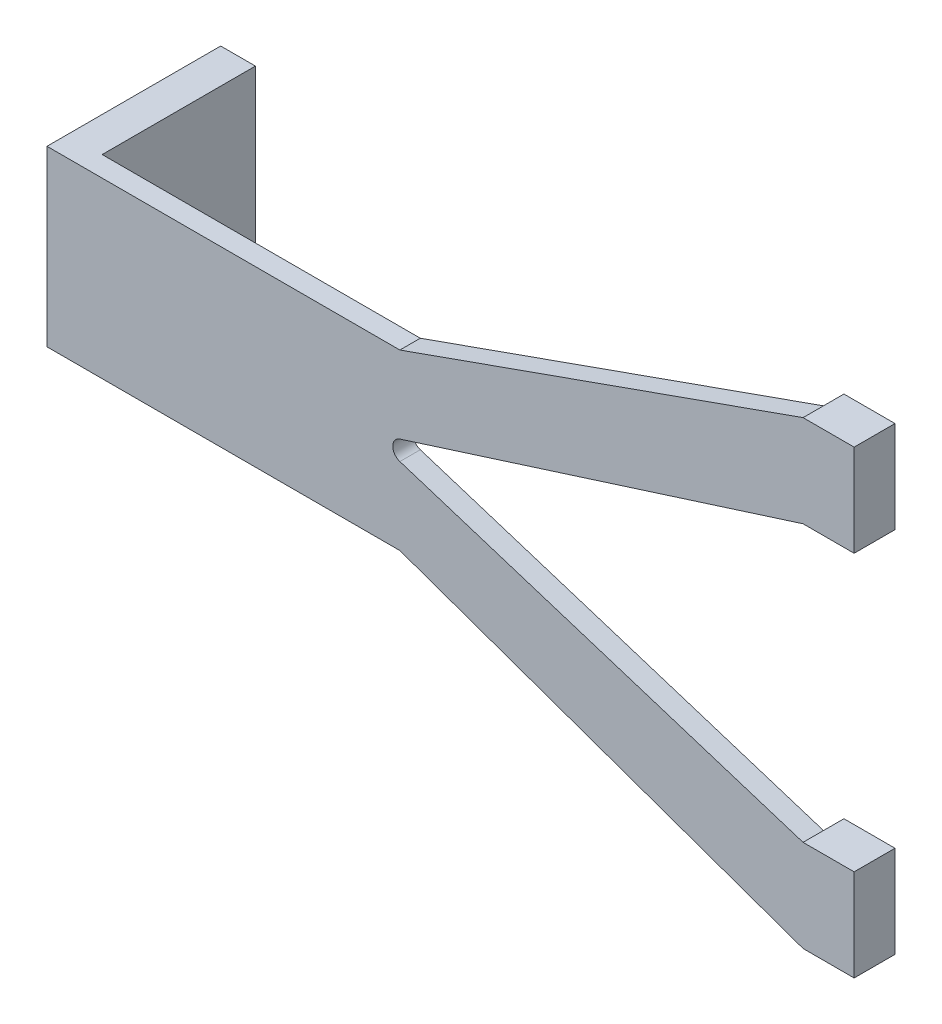
ISO-10303-21;
HEADER;
FILE_DESCRIPTION(('STEP AP214'),'2;1');
FILE_NAME('part.step','',(''),(''),'','','');
FILE_SCHEMA(('AUTOMOTIVE_DESIGN { 1 0 10303 214 1 1 1 1 }'));
ENDSEC;
DATA;
#1=APPLICATION_CONTEXT('core data for automotive mechanical design processes');
#2=APPLICATION_PROTOCOL_DEFINITION('international standard','automotive_design',2000,#1);
#3=PRODUCT_CONTEXT('',#1,'mechanical');
#4=PRODUCT('Part','Part','',(#3));
#5=PRODUCT_RELATED_PRODUCT_CATEGORY('part','',(#4));
#6=PRODUCT_DEFINITION_FORMATION('','',#4);
#7=PRODUCT_DEFINITION_CONTEXT('part definition',#1,'design');
#8=PRODUCT_DEFINITION('design','',#6,#7);
#9=PRODUCT_DEFINITION_SHAPE('','',#8);
#10=(LENGTH_UNIT() NAMED_UNIT(*) SI_UNIT(.MILLI.,.METRE.));
#11=(NAMED_UNIT(*) PLANE_ANGLE_UNIT() SI_UNIT($,.RADIAN.));
#12=(NAMED_UNIT(*) SI_UNIT($,.STERADIAN.) SOLID_ANGLE_UNIT());
#13=UNCERTAINTY_MEASURE_WITH_UNIT(LENGTH_MEASURE(1.E-05),#10,'distance_accuracy_value','');
#14=(GEOMETRIC_REPRESENTATION_CONTEXT(3) GLOBAL_UNCERTAINTY_ASSIGNED_CONTEXT((#13)) GLOBAL_UNIT_ASSIGNED_CONTEXT((#10,
#11,#12)) REPRESENTATION_CONTEXT('',''));
#15=CARTESIAN_POINT('',(0.,0.,0.));
#16=DIRECTION('',(0.,0.,1.));
#17=DIRECTION('',(1.,0.,0.));
#18=AXIS2_PLACEMENT_3D('',#15,#16,#17);
#19=CARTESIAN_POINT('',(30.9634263042626,0.,0.));
#20=DIRECTION('',(0.,0.,1.));
#21=DIRECTION('',(1.,0.,0.));
#22=AXIS2_PLACEMENT_3D('',#19,#20,#21);
#23=PLANE('',#22);
#24=DIRECTION('',(0.,1.,0.));
#25=VECTOR('',#24,1.);
#26=CARTESIAN_POINT('',(70.1215244929439,0.,0.));
#27=LINE('',#26,#25);
#28=CARTESIAN_POINT('',(70.1215244929439,-22.5,0.));
#29=VERTEX_POINT('',#28);
#30=CARTESIAN_POINT('',(70.1215244929439,-13.5,0.));
#31=VERTEX_POINT('',#30);
#32=EDGE_CURVE('E238',#29,#31,#27,.T.);
#33=ORIENTED_EDGE('',*,*,#32,.F.);
#34=DIRECTION('',(0.94244527418726,-0.334360441981553,0.));
#35=VECTOR('',#34,1.);
#36=CARTESIAN_POINT('',(30.6604155159748,-8.5,0.));
#37=LINE('',#36,#35);
#38=CARTESIAN_POINT('',(30.6604155159748,-8.5,0.));
#39=VERTEX_POINT('',#38);
#40=EDGE_CURVE('E180',#39,#29,#37,.T.);
#41=ORIENTED_EDGE('',*,*,#40,.F.);
#42=DIRECTION('',(1.,0.,0.));
#43=VECTOR('',#42,1.);
#44=CARTESIAN_POINT('',(-3.87847550705608,-8.5,0.));
#45=LINE('',#44,#43);
#46=CARTESIAN_POINT('',(-0.478475507056084,-8.5,0.));
#47=VERTEX_POINT('',#46);
#48=EDGE_CURVE('E90',#47,#39,#45,.T.);
#49=ORIENTED_EDGE('',*,*,#48,.F.);
#50=DIRECTION('',(0.,-1.,0.));
#51=VECTOR('',#50,1.);
#52=CARTESIAN_POINT('',(-0.478475507056084,-8.5,0.));
#53=LINE('',#52,#51);
#54=CARTESIAN_POINT('',(-0.478475507056084,8.5,0.));
#55=VERTEX_POINT('',#54);
#56=EDGE_CURVE('E57',#55,#47,#53,.T.);
#57=ORIENTED_EDGE('',*,*,#56,.F.);
#58=DIRECTION('',(-1.,0.,0.));
#59=VECTOR('',#58,1.);
#60=CARTESIAN_POINT('',(-3.87847550705608,8.5,0.));
#61=LINE('',#60,#59);
#62=CARTESIAN_POINT('',(30.6604155159748,8.5,0.));
#63=VERTEX_POINT('',#62);
#64=EDGE_CURVE('E175',#63,#55,#61,.T.);
#65=ORIENTED_EDGE('',*,*,#64,.F.);
#66=DIRECTION('',(-0.94244527418726,-0.334360441981553,0.));
#67=VECTOR('',#66,1.);
#68=CARTESIAN_POINT('',(30.6604155159748,8.5,0.));
#69=LINE('',#68,#67);
#70=CARTESIAN_POINT('',(70.1215244929439,22.5,0.));
#71=VERTEX_POINT('',#70);
#72=EDGE_CURVE('E172',#71,#63,#69,.T.);
#73=ORIENTED_EDGE('',*,*,#72,.F.);
#74=DIRECTION('',(0.,-1.,0.));
#75=VECTOR('',#74,1.);
#76=CARTESIAN_POINT('',(70.1215244929439,0.,0.));
#77=LINE('',#76,#75);
#78=CARTESIAN_POINT('',(70.1215244929439,13.5,0.));
#79=VERTEX_POINT('',#78);
#80=EDGE_CURVE('E359',#71,#79,#77,.T.);
#81=ORIENTED_EDGE('',*,*,#80,.T.);
#82=DIRECTION('',(0.952987125926258,0.303010788287828,0.));
#83=VECTOR('',#82,1.);
#84=CARTESIAN_POINT('',(70.1215244929439,13.5,0.));
#85=LINE('',#84,#83);
#86=CARTESIAN_POINT('',(30.6604155159748,0.95298712592625,0.));
#87=VERTEX_POINT('',#86);
#88=EDGE_CURVE('E168',#87,#79,#85,.T.);
#89=ORIENTED_EDGE('',*,*,#88,.F.);
#90=CARTESIAN_POINT('',(30.9634263042626,0.,0.));
#91=DIRECTION('',(0.,0.,-1.));
#92=DIRECTION('',(1.,0.,0.));
#93=AXIS2_PLACEMENT_3D('',#90,#91,#92);
#94=CIRCLE('',#93,0.999999999999993);
#95=CARTESIAN_POINT('',(30.6604155159748,-0.952987125926251,0.));
#96=VERTEX_POINT('',#95);
#97=EDGE_CURVE('E164',#96,#87,#94,.T.);
#98=ORIENTED_EDGE('',*,*,#97,.F.);
#99=DIRECTION('',(-0.952987125926258,0.303010788287828,0.));
#100=VECTOR('',#99,1.);
#101=CARTESIAN_POINT('',(70.1215244929439,-13.5,0.));
#102=LINE('',#101,#100);
#103=EDGE_CURVE('E161',#31,#96,#102,.T.);
#104=ORIENTED_EDGE('',*,*,#103,.F.);
#105=EDGE_LOOP('',(#33,#41,#49,#57,#65,#73,#81,#89,#98,#104));
#106=FACE_BOUND('',#105,.T.);
#107=ADVANCED_FACE('F41',(#106),#23,.F.);
#108=CARTESIAN_POINT('',(75.1215244929439,-22.5,2.));
#109=DIRECTION('',(-1.,0.,0.));
#110=DIRECTION('',(0.,0.,1.));
#111=AXIS2_PLACEMENT_3D('',#108,#109,#110);
#112=PLANE('',#111);
#113=DIRECTION('',(0.,0.,-1.));
#114=VECTOR('',#113,1.);
#115=CARTESIAN_POINT('',(75.1215244929439,-22.5,2.));
#116=LINE('',#115,#114);
#117=CARTESIAN_POINT('',(75.1215244929439,-22.5,2.));
#118=VERTEX_POINT('',#117);
#119=CARTESIAN_POINT('',(75.1215244929439,-22.5,-2.));
#120=VERTEX_POINT('',#119);
#121=EDGE_CURVE('E157',#118,#120,#116,.T.);
#122=ORIENTED_EDGE('',*,*,#121,.T.);
#123=DIRECTION('',(0.,-1.,0.));
#124=VECTOR('',#123,1.);
#125=CARTESIAN_POINT('',(75.1215244929439,0.,-2.));
#126=LINE('',#125,#124);
#127=CARTESIAN_POINT('',(75.1215244929439,-13.5,-2.));
#128=VERTEX_POINT('',#127);
#129=EDGE_CURVE('E325',#128,#120,#126,.T.);
#130=ORIENTED_EDGE('',*,*,#129,.F.);
#131=DIRECTION('',(0.,0.,-1.));
#132=VECTOR('',#131,1.);
#133=CARTESIAN_POINT('',(75.1215244929439,-13.5,2.));
#134=LINE('',#133,#132);
#135=CARTESIAN_POINT('',(75.1215244929439,-13.5,2.));
#136=VERTEX_POINT('',#135);
#137=EDGE_CURVE('E11',#136,#128,#134,.T.);
#138=ORIENTED_EDGE('',*,*,#137,.F.);
#139=DIRECTION('',(0.,1.,0.));
#140=VECTOR('',#139,1.);
#141=CARTESIAN_POINT('',(75.1215244929439,-22.5,2.));
#142=LINE('',#141,#140);
#143=EDGE_CURVE('E183',#118,#136,#142,.T.);
#144=ORIENTED_EDGE('',*,*,#143,.F.);
#145=EDGE_LOOP('',(#122,#130,#138,#144));
#146=FACE_BOUND('',#145,.T.);
#147=ADVANCED_FACE('F43',(#146),#112,.F.);
#148=CARTESIAN_POINT('',(70.1215244929439,-13.5,2.));
#149=DIRECTION('',(0.,-1.,0.));
#150=DIRECTION('',(1.,0.,0.));
#151=AXIS2_PLACEMENT_3D('',#148,#149,#150);
#152=PLANE('',#151);
#153=ORIENTED_EDGE('',*,*,#137,.T.);
#154=DIRECTION('',(1.,0.,0.));
#155=VECTOR('',#154,1.);
#156=CARTESIAN_POINT('',(0.,-13.5,-2.));
#157=LINE('',#156,#155);
#158=CARTESIAN_POINT('',(70.1215244929439,-13.5,-2.));
#159=VERTEX_POINT('',#158);
#160=EDGE_CURVE('E330',#159,#128,#157,.T.);
#161=ORIENTED_EDGE('',*,*,#160,.F.);
#162=DIRECTION('',(0.,0.,1.));
#163=VECTOR('',#162,1.);
#164=CARTESIAN_POINT('',(70.1215244929439,-13.5,-2.));
#165=LINE('',#164,#163);
#166=EDGE_CURVE('E345',#159,#31,#165,.T.);
#167=ORIENTED_EDGE('',*,*,#166,.T.);
#168=DIRECTION('',(0.,0.,-1.));
#169=VECTOR('',#168,1.);
#170=CARTESIAN_POINT('',(70.1215244929439,-13.5,2.));
#171=LINE('',#170,#169);
#172=CARTESIAN_POINT('',(70.1215244929439,-13.5,2.));
#173=VERTEX_POINT('',#172);
#174=EDGE_CURVE('E50',#173,#31,#171,.T.);
#175=ORIENTED_EDGE('',*,*,#174,.F.);
#176=DIRECTION('',(-1.,0.,0.));
#177=VECTOR('',#176,1.);
#178=CARTESIAN_POINT('',(70.1215244929439,-13.5,2.));
#179=LINE('',#178,#177);
#180=EDGE_CURVE('E98',#136,#173,#179,.T.);
#181=ORIENTED_EDGE('',*,*,#180,.F.);
#182=EDGE_LOOP('',(#153,#161,#167,#175,#181));
#183=FACE_BOUND('',#182,.T.);
#184=ADVANCED_FACE('F328',(#183),#152,.F.);
#185=CARTESIAN_POINT('',(70.1215244929439,-13.5,2.));
#186=DIRECTION('',(-0.303010788287828,-0.952987125926258,0.));
#187=DIRECTION('',(0.952987125926258,-0.303010788287828,0.));
#188=AXIS2_PLACEMENT_3D('',#185,#186,#187);
#189=PLANE('',#188);
#190=ORIENTED_EDGE('',*,*,#103,.T.);
#191=DIRECTION('',(0.,0.,-1.));
#192=VECTOR('',#191,1.);
#193=CARTESIAN_POINT('',(30.6604155159748,-0.952987125926251,2.));
#194=LINE('',#193,#192);
#195=CARTESIAN_POINT('',(30.6604155159748,-0.952987125926251,2.));
#196=VERTEX_POINT('',#195);
#197=EDGE_CURVE('E219',#196,#96,#194,.T.);
#198=ORIENTED_EDGE('',*,*,#197,.F.);
#199=DIRECTION('',(-0.952987125926258,0.303010788287828,0.));
#200=VECTOR('',#199,1.);
#201=CARTESIAN_POINT('',(70.1215244929439,-13.5,2.));
#202=LINE('',#201,#200);
#203=EDGE_CURVE('E230',#173,#196,#202,.T.);
#204=ORIENTED_EDGE('',*,*,#203,.F.);
#205=ORIENTED_EDGE('',*,*,#174,.T.);
#206=EDGE_LOOP('',(#190,#198,#204,#205));
#207=FACE_BOUND('',#206,.T.);
#208=ADVANCED_FACE('F228',(#207),#189,.F.);
#209=CARTESIAN_POINT('',(30.9634263042626,0.,2.));
#210=DIRECTION('',(0.,0.,-1.));
#211=DIRECTION('',(-1.,0.,0.));
#212=AXIS2_PLACEMENT_3D('',#209,#210,#211);
#213=CYLINDRICAL_SURFACE('',#212,0.999999999999993);
#214=ORIENTED_EDGE('',*,*,#97,.T.);
#215=DIRECTION('',(0.,0.,-1.));
#216=VECTOR('',#215,1.);
#217=CARTESIAN_POINT('',(30.6604155159748,0.95298712592625,2.));
#218=LINE('',#217,#216);
#219=CARTESIAN_POINT('',(30.6604155159748,0.95298712592625,2.));
#220=VERTEX_POINT('',#219);
#221=EDGE_CURVE('E215',#220,#87,#218,.T.);
#222=ORIENTED_EDGE('',*,*,#221,.F.);
#223=CARTESIAN_POINT('',(30.9634263042626,0.,2.));
#224=DIRECTION('',(0.,0.,-1.));
#225=DIRECTION('',(1.,0.,0.));
#226=AXIS2_PLACEMENT_3D('',#223,#224,#225);
#227=CIRCLE('',#226,0.999999999999993);
#228=EDGE_CURVE('E254',#196,#220,#227,.T.);
#229=ORIENTED_EDGE('',*,*,#228,.F.);
#230=ORIENTED_EDGE('',*,*,#197,.T.);
#231=EDGE_LOOP('',(#214,#222,#229,#230));
#232=FACE_BOUND('',#231,.T.);
#233=ADVANCED_FACE('F243',(#232),#213,.F.);
#234=CARTESIAN_POINT('',(70.1215244929439,13.5,2.));
#235=DIRECTION('',(-0.303010788287828,0.952987125926258,0.));
#236=DIRECTION('',(-0.952987125926258,-0.303010788287828,0.));
#237=AXIS2_PLACEMENT_3D('',#234,#235,#236);
#238=PLANE('',#237);
#239=ORIENTED_EDGE('',*,*,#88,.T.);
#240=DIRECTION('',(0.,0.,-1.));
#241=VECTOR('',#240,1.);
#242=CARTESIAN_POINT('',(70.1215244929439,13.5,2.));
#243=LINE('',#242,#241);
#244=CARTESIAN_POINT('',(70.1215244929439,13.5,2.));
#245=VERTEX_POINT('',#244);
#246=EDGE_CURVE('E211',#245,#79,#243,.T.);
#247=ORIENTED_EDGE('',*,*,#246,.F.);
#248=DIRECTION('',(0.952987125926258,0.303010788287828,0.));
#249=VECTOR('',#248,1.);
#250=CARTESIAN_POINT('',(70.1215244929439,13.5,2.));
#251=LINE('',#250,#249);
#252=EDGE_CURVE('E250',#220,#245,#251,.T.);
#253=ORIENTED_EDGE('',*,*,#252,.F.);
#254=ORIENTED_EDGE('',*,*,#221,.T.);
#255=EDGE_LOOP('',(#239,#247,#253,#254));
#256=FACE_BOUND('',#255,.T.);
#257=ADVANCED_FACE('F247',(#256),#238,.F.);
#258=CARTESIAN_POINT('',(70.1215244929439,13.5,2.));
#259=DIRECTION('',(0.,1.,0.));
#260=DIRECTION('',(-1.,0.,0.));
#261=AXIS2_PLACEMENT_3D('',#258,#259,#260);
#262=PLANE('',#261);
#263=ORIENTED_EDGE('',*,*,#246,.T.);
#264=DIRECTION('',(0.,0.,1.));
#265=VECTOR('',#264,1.);
#266=CARTESIAN_POINT('',(70.1215244929439,13.5,-2.));
#267=LINE('',#266,#265);
#268=CARTESIAN_POINT('',(70.1215244929439,13.5,-2.));
#269=VERTEX_POINT('',#268);
#270=EDGE_CURVE('E376',#269,#79,#267,.T.);
#271=ORIENTED_EDGE('',*,*,#270,.F.);
#272=DIRECTION('',(-1.,0.,0.));
#273=VECTOR('',#272,1.);
#274=CARTESIAN_POINT('',(0.,13.5,-2.));
#275=LINE('',#274,#273);
#276=CARTESIAN_POINT('',(75.1215244929439,13.5,-2.));
#277=VERTEX_POINT('',#276);
#278=EDGE_CURVE('E372',#277,#269,#275,.T.);
#279=ORIENTED_EDGE('',*,*,#278,.F.);
#280=DIRECTION('',(0.,0.,-1.));
#281=VECTOR('',#280,1.);
#282=CARTESIAN_POINT('',(75.1215244929439,13.5,2.));
#283=LINE('',#282,#281);
#284=CARTESIAN_POINT('',(75.1215244929439,13.5,2.));
#285=VERTEX_POINT('',#284);
#286=EDGE_CURVE('E207',#285,#277,#283,.T.);
#287=ORIENTED_EDGE('',*,*,#286,.F.);
#288=DIRECTION('',(1.,0.,0.));
#289=VECTOR('',#288,1.);
#290=CARTESIAN_POINT('',(70.1215244929439,13.5,2.));
#291=LINE('',#290,#289);
#292=EDGE_CURVE('E253',#245,#285,#291,.T.);
#293=ORIENTED_EDGE('',*,*,#292,.F.);
#294=EDGE_LOOP('',(#263,#271,#279,#287,#293));
#295=FACE_BOUND('',#294,.T.);
#296=ADVANCED_FACE('F424',(#295),#262,.F.);
#297=CARTESIAN_POINT('',(75.1215244929439,22.5,2.));
#298=DIRECTION('',(-1.,0.,0.));
#299=DIRECTION('',(0.,0.,1.));
#300=AXIS2_PLACEMENT_3D('',#297,#298,#299);
#301=PLANE('',#300);
#302=ORIENTED_EDGE('',*,*,#286,.T.);
#303=DIRECTION('',(0.,-1.,0.));
#304=VECTOR('',#303,1.);
#305=CARTESIAN_POINT('',(75.1215244929439,0.,-2.));
#306=LINE('',#305,#304);
#307=CARTESIAN_POINT('',(75.1215244929439,22.5,-2.));
#308=VERTEX_POINT('',#307);
#309=EDGE_CURVE('E368',#308,#277,#306,.T.);
#310=ORIENTED_EDGE('',*,*,#309,.F.);
#311=DIRECTION('',(0.,0.,-1.));
#312=VECTOR('',#311,1.);
#313=CARTESIAN_POINT('',(75.1215244929439,22.5,2.));
#314=LINE('',#313,#312);
#315=CARTESIAN_POINT('',(75.1215244929439,22.5,2.));
#316=VERTEX_POINT('',#315);
#317=EDGE_CURVE('E203',#316,#308,#314,.T.);
#318=ORIENTED_EDGE('',*,*,#317,.F.);
#319=DIRECTION('',(0.,1.,0.));
#320=VECTOR('',#319,1.);
#321=CARTESIAN_POINT('',(75.1215244929439,22.5,2.));
#322=LINE('',#321,#320);
#323=EDGE_CURVE('E258',#285,#316,#322,.T.);
#324=ORIENTED_EDGE('',*,*,#323,.F.);
#325=EDGE_LOOP('',(#302,#310,#318,#324));
#326=FACE_BOUND('',#325,.T.);
#327=ADVANCED_FACE('F421',(#326),#301,.F.);
#328=CARTESIAN_POINT('',(70.1215244929439,22.5,2.));
#329=DIRECTION('',(0.,-1.,0.));
#330=DIRECTION('',(0.,0.,-1.));
#331=AXIS2_PLACEMENT_3D('',#328,#329,#330);
#332=PLANE('',#331);
#333=ORIENTED_EDGE('',*,*,#317,.T.);
#334=DIRECTION('',(1.,0.,0.));
#335=VECTOR('',#334,1.);
#336=CARTESIAN_POINT('',(0.,22.5,-2.));
#337=LINE('',#336,#335);
#338=CARTESIAN_POINT('',(70.1215244929439,22.5,-2.));
#339=VERTEX_POINT('',#338);
#340=EDGE_CURVE('E364',#339,#308,#337,.T.);
#341=ORIENTED_EDGE('',*,*,#340,.F.);
#342=DIRECTION('',(0.,0.,1.));
#343=VECTOR('',#342,1.);
#344=CARTESIAN_POINT('',(70.1215244929439,22.5,-2.));
#345=LINE('',#344,#343);
#346=EDGE_CURVE('E310',#339,#71,#345,.T.);
#347=ORIENTED_EDGE('',*,*,#346,.T.);
#348=DIRECTION('',(0.,0.,-1.));
#349=VECTOR('',#348,1.);
#350=CARTESIAN_POINT('',(70.1215244929439,22.5,2.));
#351=LINE('',#350,#349);
#352=CARTESIAN_POINT('',(70.1215244929439,22.5,2.));
#353=VERTEX_POINT('',#352);
#354=EDGE_CURVE('E199',#353,#71,#351,.T.);
#355=ORIENTED_EDGE('',*,*,#354,.F.);
#356=DIRECTION('',(-1.,0.,0.));
#357=VECTOR('',#356,1.);
#358=CARTESIAN_POINT('',(70.1215244929439,22.5,2.));
#359=LINE('',#358,#357);
#360=EDGE_CURVE('E265',#316,#353,#359,.T.);
#361=ORIENTED_EDGE('',*,*,#360,.F.);
#362=EDGE_LOOP('',(#333,#341,#347,#355,#361));
#363=FACE_BOUND('',#362,.T.);
#364=ADVANCED_FACE('F415',(#363),#332,.F.);
#365=CARTESIAN_POINT('',(30.6604155159748,8.5,2.));
#366=DIRECTION('',(0.334360441981553,-0.94244527418726,0.));
#367=DIRECTION('',(0.94244527418726,0.334360441981553,0.));
#368=AXIS2_PLACEMENT_3D('',#365,#366,#367);
#369=PLANE('',#368);
#370=ORIENTED_EDGE('',*,*,#72,.T.);
#371=DIRECTION('',(0.,0.,-1.));
#372=VECTOR('',#371,1.);
#373=CARTESIAN_POINT('',(30.6604155159748,8.5,2.));
#374=LINE('',#373,#372);
#375=CARTESIAN_POINT('',(30.6604155159748,8.5,2.));
#376=VERTEX_POINT('',#375);
#377=EDGE_CURVE('E195',#376,#63,#374,.T.);
#378=ORIENTED_EDGE('',*,*,#377,.F.);
#379=DIRECTION('',(-0.94244527418726,-0.334360441981553,0.));
#380=VECTOR('',#379,1.);
#381=CARTESIAN_POINT('',(30.6604155159748,8.5,2.));
#382=LINE('',#381,#380);
#383=EDGE_CURVE('E268',#353,#376,#382,.T.);
#384=ORIENTED_EDGE('',*,*,#383,.F.);
#385=ORIENTED_EDGE('',*,*,#354,.T.);
#386=EDGE_LOOP('',(#370,#378,#384,#385));
#387=FACE_BOUND('',#386,.T.);
#388=ADVANCED_FACE('F428',(#387),#369,.F.);
#389=CARTESIAN_POINT('',(-3.87847550705608,8.5,2.));
#390=DIRECTION('',(0.,-1.,0.));
#391=DIRECTION('',(1.,0.,0.));
#392=AXIS2_PLACEMENT_3D('',#389,#390,#391);
#393=PLANE('',#392);
#394=ORIENTED_EDGE('',*,*,#64,.T.);
#395=DIRECTION('',(0.,0.,1.));
#396=VECTOR('',#395,1.);
#397=CARTESIAN_POINT('',(-0.478475507056084,8.5,-15.));
#398=LINE('',#397,#396);
#399=CARTESIAN_POINT('',(-0.478475507056084,8.5,-15.));
#400=VERTEX_POINT('',#399);
#401=EDGE_CURVE('E165',#400,#55,#398,.T.);
#402=ORIENTED_EDGE('',*,*,#401,.F.);
#403=DIRECTION('',(1.,0.,0.));
#404=VECTOR('',#403,1.);
#405=CARTESIAN_POINT('',(-3.87847550705608,8.5,-15.));
#406=LINE('',#405,#404);
#407=CARTESIAN_POINT('',(-3.87847550705608,8.5,-15.));
#408=VERTEX_POINT('',#407);
#409=EDGE_CURVE('E284',#408,#400,#406,.T.);
#410=ORIENTED_EDGE('',*,*,#409,.F.);
#411=DIRECTION('',(0.,0.,-1.));
#412=VECTOR('',#411,1.);
#413=CARTESIAN_POINT('',(-3.87847550705608,8.5,2.));
#414=LINE('',#413,#412);
#415=CARTESIAN_POINT('',(-3.87847550705608,8.5,2.));
#416=VERTEX_POINT('',#415);
#417=EDGE_CURVE('E191',#416,#408,#414,.T.);
#418=ORIENTED_EDGE('',*,*,#417,.F.);
#419=DIRECTION('',(-1.,0.,0.));
#420=VECTOR('',#419,1.);
#421=CARTESIAN_POINT('',(-3.87847550705608,8.5,2.));
#422=LINE('',#421,#420);
#423=EDGE_CURVE('E271',#376,#416,#422,.T.);
#424=ORIENTED_EDGE('',*,*,#423,.F.);
#425=ORIENTED_EDGE('',*,*,#377,.T.);
#426=EDGE_LOOP('',(#394,#402,#410,#418,#424,#425));
#427=FACE_BOUND('',#426,.T.);
#428=ADVANCED_FACE('F280',(#427),#393,.F.);
#429=CARTESIAN_POINT('',(-3.87847550705608,-8.5,2.));
#430=DIRECTION('',(1.,0.,0.));
#431=DIRECTION('',(0.,0.,-1.));
#432=AXIS2_PLACEMENT_3D('',#429,#430,#431);
#433=PLANE('',#432);
#434=ORIENTED_EDGE('',*,*,#417,.T.);
#435=DIRECTION('',(0.,1.,0.));
#436=VECTOR('',#435,1.);
#437=CARTESIAN_POINT('',(-3.87847550705608,-8.5,-15.));
#438=LINE('',#437,#436);
#439=CARTESIAN_POINT('',(-3.87847550705608,-8.5,-15.));
#440=VERTEX_POINT('',#439);
#441=EDGE_CURVE('E289',#440,#408,#438,.T.);
#442=ORIENTED_EDGE('',*,*,#441,.F.);
#443=DIRECTION('',(0.,0.,-1.));
#444=VECTOR('',#443,1.);
#445=CARTESIAN_POINT('',(-3.87847550705608,-8.5,2.));
#446=LINE('',#445,#444);
#447=CARTESIAN_POINT('',(-3.87847550705608,-8.5,2.));
#448=VERTEX_POINT('',#447);
#449=EDGE_CURVE('E149',#448,#440,#446,.T.);
#450=ORIENTED_EDGE('',*,*,#449,.F.);
#451=DIRECTION('',(0.,-1.,0.));
#452=VECTOR('',#451,1.);
#453=CARTESIAN_POINT('',(-3.87847550705608,-8.5,2.));
#454=LINE('',#453,#452);
#455=EDGE_CURVE('E138',#416,#448,#454,.T.);
#456=ORIENTED_EDGE('',*,*,#455,.F.);
#457=EDGE_LOOP('',(#434,#442,#450,#456));
#458=FACE_BOUND('',#457,.T.);
#459=ADVANCED_FACE('F288',(#458),#433,.F.);
#460=CARTESIAN_POINT('',(-3.87847550705608,-8.5,2.));
#461=DIRECTION('',(0.,1.,0.));
#462=DIRECTION('',(-1.,0.,0.));
#463=AXIS2_PLACEMENT_3D('',#460,#461,#462);
#464=PLANE('',#463);
#465=ORIENTED_EDGE('',*,*,#449,.T.);
#466=DIRECTION('',(-1.,0.,0.));
#467=VECTOR('',#466,1.);
#468=CARTESIAN_POINT('',(-3.87847550705608,-8.5,-15.));
#469=LINE('',#468,#467);
#470=CARTESIAN_POINT('',(-0.478475507056084,-8.5,-15.));
#471=VERTEX_POINT('',#470);
#472=EDGE_CURVE('E293',#471,#440,#469,.T.);
#473=ORIENTED_EDGE('',*,*,#472,.F.);
#474=DIRECTION('',(0.,0.,1.));
#475=VECTOR('',#474,1.);
#476=CARTESIAN_POINT('',(-0.478475507056084,-8.5,-15.));
#477=LINE('',#476,#475);
#478=EDGE_CURVE('E301',#471,#47,#477,.T.);
#479=ORIENTED_EDGE('',*,*,#478,.T.);
#480=ORIENTED_EDGE('',*,*,#48,.T.);
#481=DIRECTION('',(0.,0.,-1.));
#482=VECTOR('',#481,1.);
#483=CARTESIAN_POINT('',(30.6604155159748,-8.5,2.));
#484=LINE('',#483,#482);
#485=CARTESIAN_POINT('',(30.6604155159748,-8.5,2.));
#486=VERTEX_POINT('',#485);
#487=EDGE_CURVE('E143',#486,#39,#484,.T.);
#488=ORIENTED_EDGE('',*,*,#487,.F.);
#489=DIRECTION('',(1.,0.,0.));
#490=VECTOR('',#489,1.);
#491=CARTESIAN_POINT('',(-3.87847550705608,-8.5,2.));
#492=LINE('',#491,#490);
#493=EDGE_CURVE('E132',#448,#486,#492,.T.);
#494=ORIENTED_EDGE('',*,*,#493,.F.);
#495=EDGE_LOOP('',(#465,#473,#479,#480,#488,#494));
#496=FACE_BOUND('',#495,.T.);
#497=ADVANCED_FACE('F144',(#496),#464,.F.);
#498=CARTESIAN_POINT('',(30.6604155159748,-8.5,2.));
#499=DIRECTION('',(0.334360441981553,0.94244527418726,0.));
#500=DIRECTION('',(-0.94244527418726,0.334360441981553,0.));
#501=AXIS2_PLACEMENT_3D('',#498,#499,#500);
#502=PLANE('',#501);
#503=ORIENTED_EDGE('',*,*,#40,.T.);
#504=DIRECTION('',(0.,0.,-1.));
#505=VECTOR('',#504,1.);
#506=CARTESIAN_POINT('',(70.1215244929439,-22.5,2.));
#507=LINE('',#506,#505);
#508=CARTESIAN_POINT('',(70.1215244929439,-22.5,2.));
#509=VERTEX_POINT('',#508);
#510=EDGE_CURVE('E150',#509,#29,#507,.T.);
#511=ORIENTED_EDGE('',*,*,#510,.F.);
#512=DIRECTION('',(0.94244527418726,-0.334360441981553,0.));
#513=VECTOR('',#512,1.);
#514=CARTESIAN_POINT('',(30.6604155159748,-8.5,2.));
#515=LINE('',#514,#513);
#516=EDGE_CURVE('E135',#486,#509,#515,.T.);
#517=ORIENTED_EDGE('',*,*,#516,.F.);
#518=ORIENTED_EDGE('',*,*,#487,.T.);
#519=EDGE_LOOP('',(#503,#511,#517,#518));
#520=FACE_BOUND('',#519,.T.);
#521=ADVANCED_FACE('F152',(#520),#502,.F.);
#522=CARTESIAN_POINT('',(70.1215244929439,-22.5,2.));
#523=DIRECTION('',(0.,1.,0.));
#524=DIRECTION('',(0.,0.,1.));
#525=AXIS2_PLACEMENT_3D('',#522,#523,#524);
#526=PLANE('',#525);
#527=ORIENTED_EDGE('',*,*,#510,.T.);
#528=DIRECTION('',(0.,0.,1.));
#529=VECTOR('',#528,1.);
#530=CARTESIAN_POINT('',(70.1215244929439,-22.5,-2.));
#531=LINE('',#530,#529);
#532=CARTESIAN_POINT('',(70.1215244929439,-22.5,-2.));
#533=VERTEX_POINT('',#532);
#534=EDGE_CURVE('E355',#533,#29,#531,.T.);
#535=ORIENTED_EDGE('',*,*,#534,.F.);
#536=DIRECTION('',(-1.,0.,0.));
#537=VECTOR('',#536,1.);
#538=CARTESIAN_POINT('',(0.,-22.5,-2.));
#539=LINE('',#538,#537);
#540=EDGE_CURVE('E347',#120,#533,#539,.T.);
#541=ORIENTED_EDGE('',*,*,#540,.F.);
#542=ORIENTED_EDGE('',*,*,#121,.F.);
#543=DIRECTION('',(1.,0.,0.));
#544=VECTOR('',#543,1.);
#545=CARTESIAN_POINT('',(70.1215244929439,-22.5,2.));
#546=LINE('',#545,#544);
#547=EDGE_CURVE('E66',#509,#118,#546,.T.);
#548=ORIENTED_EDGE('',*,*,#547,.F.);
#549=EDGE_LOOP('',(#527,#535,#541,#542,#548));
#550=FACE_BOUND('',#549,.T.);
#551=ADVANCED_FACE('F445',(#550),#526,.F.);
#552=CARTESIAN_POINT('',(30.9634263042626,0.,2.));
#553=DIRECTION('',(0.,0.,1.));
#554=DIRECTION('',(1.,0.,0.));
#555=AXIS2_PLACEMENT_3D('',#552,#553,#554);
#556=PLANE('',#555);
#557=ORIENTED_EDGE('',*,*,#143,.T.);
#558=ORIENTED_EDGE('',*,*,#180,.T.);
#559=ORIENTED_EDGE('',*,*,#203,.T.);
#560=ORIENTED_EDGE('',*,*,#228,.T.);
#561=ORIENTED_EDGE('',*,*,#252,.T.);
#562=ORIENTED_EDGE('',*,*,#292,.T.);
#563=ORIENTED_EDGE('',*,*,#323,.T.);
#564=ORIENTED_EDGE('',*,*,#360,.T.);
#565=ORIENTED_EDGE('',*,*,#383,.T.);
#566=ORIENTED_EDGE('',*,*,#423,.T.);
#567=ORIENTED_EDGE('',*,*,#455,.T.);
#568=ORIENTED_EDGE('',*,*,#493,.T.);
#569=ORIENTED_EDGE('',*,*,#516,.T.);
#570=ORIENTED_EDGE('',*,*,#547,.T.);
#571=EDGE_LOOP('',(#557,#558,#559,#560,#561,#562,#563,#564,#565,#566,#567,#568,#569,#570));
#572=FACE_BOUND('',#571,.T.);
#573=ADVANCED_FACE('F133',(#572),#556,.T.);
#574=CARTESIAN_POINT('',(-0.478475507056084,-8.5,-15.));
#575=DIRECTION('',(-1.,0.,0.));
#576=DIRECTION('',(0.,-1.,0.));
#577=AXIS2_PLACEMENT_3D('',#574,#575,#576);
#578=PLANE('',#577);
#579=ORIENTED_EDGE('',*,*,#56,.T.);
#580=ORIENTED_EDGE('',*,*,#478,.F.);
#581=DIRECTION('',(0.,-1.,0.));
#582=VECTOR('',#581,1.);
#583=CARTESIAN_POINT('',(-0.478475507056084,-8.5,-15.));
#584=LINE('',#583,#582);
#585=EDGE_CURVE('E298',#400,#471,#584,.T.);
#586=ORIENTED_EDGE('',*,*,#585,.F.);
#587=ORIENTED_EDGE('',*,*,#401,.T.);
#588=EDGE_LOOP('',(#579,#580,#586,#587));
#589=FACE_BOUND('',#588,.T.);
#590=ADVANCED_FACE('F390',(#589),#578,.F.);
#591=CARTESIAN_POINT('',(0.,0.,-15.));
#592=DIRECTION('',(0.,0.,-1.));
#593=DIRECTION('',(-1.,0.,0.));
#594=AXIS2_PLACEMENT_3D('',#591,#592,#593);
#595=PLANE('',#594);
#596=ORIENTED_EDGE('',*,*,#441,.T.);
#597=ORIENTED_EDGE('',*,*,#409,.T.);
#598=ORIENTED_EDGE('',*,*,#585,.T.);
#599=ORIENTED_EDGE('',*,*,#472,.T.);
#600=EDGE_LOOP('',(#596,#597,#598,#599));
#601=FACE_BOUND('',#600,.T.);
#602=ADVANCED_FACE('F296',(#601),#595,.T.);
#603=CARTESIAN_POINT('',(70.1215244929439,0.,-2.));
#604=DIRECTION('',(-1.,0.,0.));
#605=DIRECTION('',(0.,0.,1.));
#606=AXIS2_PLACEMENT_3D('',#603,#604,#605);
#607=PLANE('',#606);
#608=ORIENTED_EDGE('',*,*,#80,.F.);
#609=ORIENTED_EDGE('',*,*,#346,.F.);
#610=DIRECTION('',(0.,-1.,0.));
#611=VECTOR('',#610,1.);
#612=CARTESIAN_POINT('',(70.1215244929439,0.,-2.));
#613=LINE('',#612,#611);
#614=EDGE_CURVE('E360',#339,#269,#613,.T.);
#615=ORIENTED_EDGE('',*,*,#614,.T.);
#616=ORIENTED_EDGE('',*,*,#270,.T.);
#617=EDGE_LOOP('',(#608,#609,#615,#616));
#618=FACE_BOUND('',#617,.T.);
#619=ADVANCED_FACE('F425',(#618),#607,.T.);
#620=CARTESIAN_POINT('',(0.,0.,-2.));
#621=DIRECTION('',(0.,0.,-1.));
#622=DIRECTION('',(-1.,0.,0.));
#623=AXIS2_PLACEMENT_3D('',#620,#621,#622);
#624=PLANE('',#623);
#625=ORIENTED_EDGE('',*,*,#614,.F.);
#626=ORIENTED_EDGE('',*,*,#340,.T.);
#627=ORIENTED_EDGE('',*,*,#309,.T.);
#628=ORIENTED_EDGE('',*,*,#278,.T.);
#629=EDGE_LOOP('',(#625,#626,#627,#628));
#630=FACE_BOUND('',#629,.T.);
#631=ADVANCED_FACE('F420',(#630),#624,.T.);
#632=CARTESIAN_POINT('',(70.1215244929439,0.,-2.));
#633=DIRECTION('',(1.,0.,0.));
#634=DIRECTION('',(0.,0.,-1.));
#635=AXIS2_PLACEMENT_3D('',#632,#633,#634);
#636=PLANE('',#635);
#637=ORIENTED_EDGE('',*,*,#32,.T.);
#638=ORIENTED_EDGE('',*,*,#166,.F.);
#639=DIRECTION('',(0.,1.,0.));
#640=VECTOR('',#639,1.);
#641=CARTESIAN_POINT('',(70.1215244929439,0.,-2.));
#642=LINE('',#641,#640);
#643=EDGE_CURVE('E339',#533,#159,#642,.T.);
#644=ORIENTED_EDGE('',*,*,#643,.F.);
#645=ORIENTED_EDGE('',*,*,#534,.T.);
#646=EDGE_LOOP('',(#637,#638,#644,#645));
#647=FACE_BOUND('',#646,.T.);
#648=ADVANCED_FACE('F499',(#647),#636,.F.);
#649=CARTESIAN_POINT('',(0.,0.,-2.));
#650=DIRECTION('',(0.,0.,-1.));
#651=DIRECTION('',(-1.,0.,0.));
#652=AXIS2_PLACEMENT_3D('',#649,#650,#651);
#653=PLANE('',#652);
#654=ORIENTED_EDGE('',*,*,#540,.T.);
#655=ORIENTED_EDGE('',*,*,#643,.T.);
#656=ORIENTED_EDGE('',*,*,#160,.T.);
#657=ORIENTED_EDGE('',*,*,#129,.T.);
#658=EDGE_LOOP('',(#654,#655,#656,#657));
#659=FACE_BOUND('',#658,.T.);
#660=ADVANCED_FACE('F336',(#659),#653,.T.);
#661=CLOSED_SHELL('',(#107,#147,#184,#208,#233,#257,#296,#327,#364,#388,#428,#459,#497,#521,
#551,#573,#590,#602,#619,#631,#648,#660));
#662=MANIFOLD_SOLID_BREP('B2',#661);
#663=ADVANCED_BREP_SHAPE_REPRESENTATION('',(#18,#662),#14);
#664=SHAPE_DEFINITION_REPRESENTATION(#9,#663);
ENDSEC;
END-ISO-10303-21;
